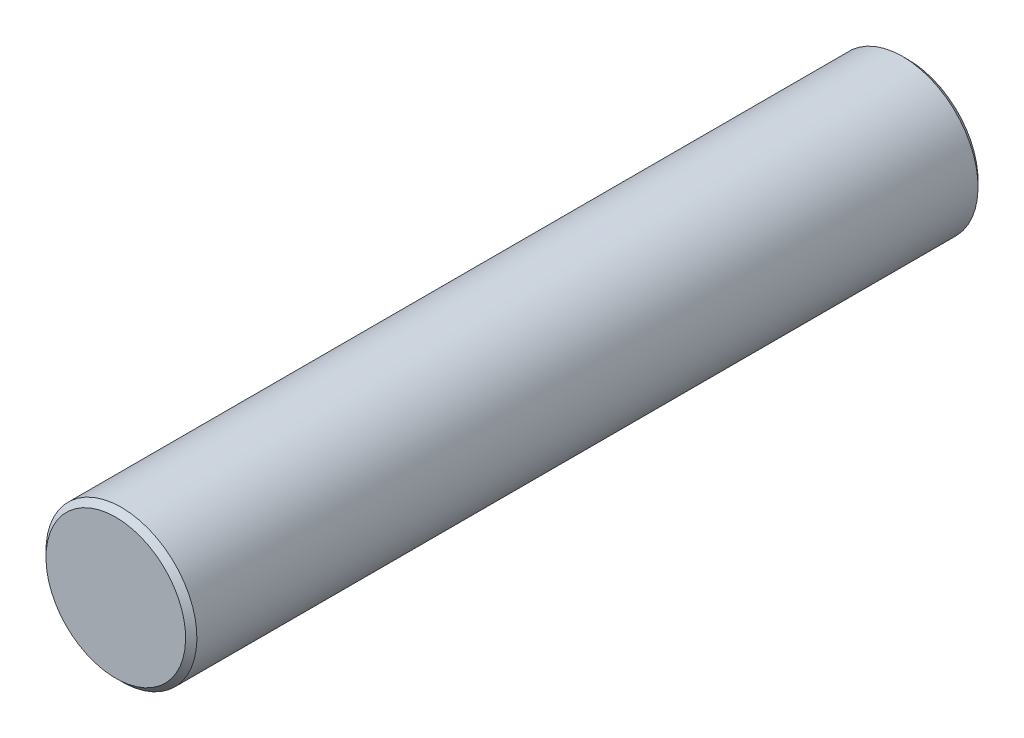
ISO-10303-21;
HEADER;
FILE_DESCRIPTION(('STEP AP214'),'2;1');
FILE_NAME('part.step','',(''),(''),'','','');
FILE_SCHEMA(('AUTOMOTIVE_DESIGN { 1 0 10303 214 1 1 1 1 }'));
ENDSEC;
DATA;
#1=APPLICATION_CONTEXT('core data for automotive mechanical design processes');
#2=APPLICATION_PROTOCOL_DEFINITION('international standard','automotive_design',2000,#1);
#3=PRODUCT_CONTEXT('',#1,'mechanical');
#4=PRODUCT('Part','Part','',(#3));
#5=PRODUCT_RELATED_PRODUCT_CATEGORY('part','',(#4));
#6=PRODUCT_DEFINITION_FORMATION('','',#4);
#7=PRODUCT_DEFINITION_CONTEXT('part definition',#1,'design');
#8=PRODUCT_DEFINITION('design','',#6,#7);
#9=PRODUCT_DEFINITION_SHAPE('','',#8);
#10=(LENGTH_UNIT() NAMED_UNIT(*) SI_UNIT(.MILLI.,.METRE.));
#11=(NAMED_UNIT(*) PLANE_ANGLE_UNIT() SI_UNIT($,.RADIAN.));
#12=(NAMED_UNIT(*) SI_UNIT($,.STERADIAN.) SOLID_ANGLE_UNIT());
#13=UNCERTAINTY_MEASURE_WITH_UNIT(LENGTH_MEASURE(1.E-05),#10,'distance_accuracy_value','');
#14=(GEOMETRIC_REPRESENTATION_CONTEXT(3) GLOBAL_UNCERTAINTY_ASSIGNED_CONTEXT((#13)) GLOBAL_UNIT_ASSIGNED_CONTEXT((#10,
#11,#12)) REPRESENTATION_CONTEXT('',''));
#15=CARTESIAN_POINT('',(0.,0.,0.));
#16=DIRECTION('',(0.,0.,1.));
#17=DIRECTION('',(1.,0.,0.));
#18=AXIS2_PLACEMENT_3D('',#15,#16,#17);
#19=CARTESIAN_POINT('',(0.,9.25,0.));
#20=DIRECTION('',(0.,0.,-1.));
#21=DIRECTION('',(0.,1.,0.));
#22=AXIS2_PLACEMENT_3D('',#19,#20,#21);
#23=PLANE('',#22);
#24=CARTESIAN_POINT('',(0.,0.,0.));
#25=DIRECTION('',(0.,0.,-1.));
#26=DIRECTION('',(0.,1.,0.));
#27=AXIS2_PLACEMENT_3D('',#24,#25,#26);
#28=CIRCLE('',#27,18.5);
#29=CARTESIAN_POINT('',(0.,18.5,0.));
#30=VERTEX_POINT('',#29);
#31=EDGE_CURVE('E9',#30,#30,#28,.T.);
#32=ORIENTED_EDGE('',*,*,#31,.T.);
#33=EDGE_LOOP('',(#32));
#34=FACE_BOUND('',#33,.T.);
#35=CARTESIAN_POINT('',(0.,0.,0.));
#36=DIRECTION('',(0.,0.,1.));
#37=DIRECTION('',(-1.,0.,0.));
#38=AXIS2_PLACEMENT_3D('',#35,#36,#37);
#39=CIRCLE('',#38,6.);
#40=CARTESIAN_POINT('',(-6.,0.,0.));
#41=VERTEX_POINT('',#40);
#42=EDGE_CURVE('E68',#41,#41,#39,.T.);
#43=ORIENTED_EDGE('',*,*,#42,.T.);
#44=EDGE_LOOP('',(#43));
#45=FACE_BOUND('',#44,.T.);
#46=ADVANCED_FACE('F15',(#34,#45),#23,.T.);
#47=CARTESIAN_POINT('',(0.,0.,0.75));
#48=DIRECTION('',(0.,0.,1.));
#49=DIRECTION('',(0.,1.,0.));
#50=AXIS2_PLACEMENT_3D('',#47,#48,#49);
#51=CONICAL_SURFACE('',#50,19.25,0.785398163397448);
#52=CARTESIAN_POINT('',(0.,0.,1.5));
#53=DIRECTION('',(0.,0.,-1.));
#54=DIRECTION('',(0.,1.,0.));
#55=AXIS2_PLACEMENT_3D('',#52,#53,#54);
#56=CIRCLE('',#55,20.);
#57=CARTESIAN_POINT('',(0.,20.,1.5));
#58=VERTEX_POINT('',#57);
#59=EDGE_CURVE('E22',#58,#58,#56,.T.);
#60=ORIENTED_EDGE('',*,*,#59,.T.);
#61=EDGE_LOOP('',(#60));
#62=FACE_BOUND('',#61,.T.);
#63=ORIENTED_EDGE('',*,*,#31,.F.);
#64=EDGE_LOOP('',(#63));
#65=FACE_BOUND('',#64,.T.);
#66=ADVANCED_FACE('F113',(#62,#65),#51,.T.);
#67=CARTESIAN_POINT('',(0.,0.,105.));
#68=DIRECTION('',(0.,0.,1.));
#69=DIRECTION('',(0.,1.,0.));
#70=AXIS2_PLACEMENT_3D('',#67,#68,#69);
#71=CYLINDRICAL_SURFACE('',#70,20.);
#72=CARTESIAN_POINT('',(0.,0.,208.5));
#73=DIRECTION('',(0.,0.,-1.));
#74=DIRECTION('',(0.,1.,0.));
#75=AXIS2_PLACEMENT_3D('',#72,#73,#74);
#76=CIRCLE('',#75,20.);
#77=CARTESIAN_POINT('',(0.,20.,208.5));
#78=VERTEX_POINT('',#77);
#79=EDGE_CURVE('E65',#78,#78,#76,.T.);
#80=ORIENTED_EDGE('',*,*,#79,.T.);
#81=EDGE_LOOP('',(#80));
#82=FACE_BOUND('',#81,.T.);
#83=ORIENTED_EDGE('',*,*,#59,.F.);
#84=EDGE_LOOP('',(#83));
#85=FACE_BOUND('',#84,.T.);
#86=CARTESIAN_POINT('',(0.,0.,6.5));
#87=DIRECTION('',(0.,0.,-1.));
#88=DIRECTION('',(0.,1.,0.));
#89=AXIS2_PLACEMENT_3D('',#86,#87,#88);
#90=CIRCLE('',#89,20.);
#91=CARTESIAN_POINT('',(10.5356537528527,-17.,6.5));
#92=VERTEX_POINT('',#91);
#93=CARTESIAN_POINT('',(-10.5356537528527,-17.,6.5));
#94=VERTEX_POINT('',#93);
#95=EDGE_CURVE('E81',#92,#94,#90,.T.);
#96=ORIENTED_EDGE('',*,*,#95,.T.);
#97=DIRECTION('',(0.,0.,1.));
#98=VECTOR('',#97,1.);
#99=CARTESIAN_POINT('',(-10.5356537528527,-17.,8.25));
#100=LINE('',#99,#98);
#101=CARTESIAN_POINT('',(-10.5356537528527,-17.,10.));
#102=VERTEX_POINT('',#101);
#103=EDGE_CURVE('E75',#94,#102,#100,.T.);
#104=ORIENTED_EDGE('',*,*,#103,.T.);
#105=CARTESIAN_POINT('',(0.,0.,10.));
#106=DIRECTION('',(0.,0.,1.));
#107=DIRECTION('',(0.,1.,0.));
#108=AXIS2_PLACEMENT_3D('',#105,#106,#107);
#109=CIRCLE('',#108,20.);
#110=CARTESIAN_POINT('',(10.5356537528527,-17.,10.));
#111=VERTEX_POINT('',#110);
#112=EDGE_CURVE('E87',#102,#111,#109,.T.);
#113=ORIENTED_EDGE('',*,*,#112,.T.);
#114=DIRECTION('',(0.,0.,-1.));
#115=VECTOR('',#114,1.);
#116=CARTESIAN_POINT('',(10.5356537528527,-17.,8.25));
#117=LINE('',#116,#115);
#118=EDGE_CURVE('E74',#111,#92,#117,.T.);
#119=ORIENTED_EDGE('',*,*,#118,.T.);
#120=EDGE_LOOP('',(#96,#104,#113,#119));
#121=FACE_BOUND('',#120,.T.);
#122=ADVANCED_FACE('F92',(#82,#85,#121),#71,.T.);
#123=CARTESIAN_POINT('',(0.,0.,209.25));
#124=DIRECTION('',(0.,0.,-1.));
#125=DIRECTION('',(0.,1.,0.));
#126=AXIS2_PLACEMENT_3D('',#123,#124,#125);
#127=CONICAL_SURFACE('',#126,19.25,0.785398163397448);
#128=CARTESIAN_POINT('',(0.,0.,210.));
#129=DIRECTION('',(0.,0.,-1.));
#130=DIRECTION('',(0.,1.,0.));
#131=AXIS2_PLACEMENT_3D('',#128,#129,#130);
#132=CIRCLE('',#131,18.5);
#133=CARTESIAN_POINT('',(0.,18.5,210.));
#134=VERTEX_POINT('',#133);
#135=EDGE_CURVE('E61',#134,#134,#132,.T.);
#136=ORIENTED_EDGE('',*,*,#135,.T.);
#137=EDGE_LOOP('',(#136));
#138=FACE_BOUND('',#137,.T.);
#139=ORIENTED_EDGE('',*,*,#79,.F.);
#140=EDGE_LOOP('',(#139));
#141=FACE_BOUND('',#140,.T.);
#142=ADVANCED_FACE('F62',(#138,#141),#127,.T.);
#143=CARTESIAN_POINT('',(0.,9.25,210.));
#144=DIRECTION('',(0.,0.,1.));
#145=DIRECTION('',(0.,-1.,0.));
#146=AXIS2_PLACEMENT_3D('',#143,#144,#145);
#147=PLANE('',#146);
#148=ORIENTED_EDGE('',*,*,#135,.F.);
#149=EDGE_LOOP('',(#148));
#150=FACE_BOUND('',#149,.T.);
#151=ADVANCED_FACE('F135',(#150),#147,.T.);
#152=CARTESIAN_POINT('',(0.,0.,26.4586213285198));
#153=DIRECTION('',(0.,0.,-1.));
#154=DIRECTION('',(-1.,0.,0.));
#155=AXIS2_PLACEMENT_3D('',#152,#153,#154);
#156=CONICAL_SURFACE('',#155,2.52640625,1.0471975511966);
#157=CARTESIAN_POINT('',(0.,0.,25.));
#158=DIRECTION('',(0.,0.,1.));
#159=DIRECTION('',(-1.,0.,0.));
#160=AXIS2_PLACEMENT_3D('',#157,#158,#159);
#161=CIRCLE('',#160,5.0528125);
#162=CARTESIAN_POINT('',(-5.0528125,0.,25.));
#163=VERTEX_POINT('',#162);
#164=EDGE_CURVE('E66',#163,#163,#161,.T.);
#165=ORIENTED_EDGE('',*,*,#164,.F.);
#166=EDGE_LOOP('',(#165));
#167=FACE_BOUND('',#166,.T.);
#168=CARTESIAN_POINT('',(0.,0.,27.9172426570397));
#169=VERTEX_POINT('',#168);
#170=VERTEX_LOOP('',#169);
#171=FACE_BOUND('',#170,.T.);
#172=ADVANCED_FACE('F129',(#167,#171),#156,.F.);
#173=CARTESIAN_POINT('',(0.,0.,12.97359375));
#174=DIRECTION('',(0.,0.,-1.));
#175=DIRECTION('',(-1.,0.,0.));
#176=AXIS2_PLACEMENT_3D('',#173,#174,#175);
#177=CYLINDRICAL_SURFACE('',#176,5.0528125);
#178=CARTESIAN_POINT('',(0.,0.,0.9471875));
#179=DIRECTION('',(0.,0.,1.));
#180=DIRECTION('',(-1.,0.,0.));
#181=AXIS2_PLACEMENT_3D('',#178,#179,#180);
#182=CIRCLE('',#181,5.0528125);
#183=CARTESIAN_POINT('',(-5.0528125,0.,0.9471875));
#184=VERTEX_POINT('',#183);
#185=EDGE_CURVE('E72',#184,#184,#182,.T.);
#186=ORIENTED_EDGE('',*,*,#185,.F.);
#187=EDGE_LOOP('',(#186));
#188=FACE_BOUND('',#187,.T.);
#189=ORIENTED_EDGE('',*,*,#164,.T.);
#190=EDGE_LOOP('',(#189));
#191=FACE_BOUND('',#190,.T.);
#192=ADVANCED_FACE('F123',(#188,#191),#177,.F.);
#193=CARTESIAN_POINT('',(0.,0.,0.47359375));
#194=DIRECTION('',(0.,0.,-1.));
#195=DIRECTION('',(-1.,0.,0.));
#196=AXIS2_PLACEMENT_3D('',#193,#194,#195);
#197=CONICAL_SURFACE('',#196,5.52640625,0.785398163397448);
#198=ORIENTED_EDGE('',*,*,#42,.F.);
#199=EDGE_LOOP('',(#198));
#200=FACE_BOUND('',#199,.T.);
#201=ORIENTED_EDGE('',*,*,#185,.T.);
#202=EDGE_LOOP('',(#201));
#203=FACE_BOUND('',#202,.T.);
#204=ADVANCED_FACE('F110',(#200,#203),#197,.F.);
#205=CARTESIAN_POINT('',(0.,-17.,8.25));
#206=DIRECTION('',(0.,-1.,0.));
#207=DIRECTION('',(0.,0.,-1.));
#208=AXIS2_PLACEMENT_3D('',#205,#206,#207);
#209=PLANE('',#208);
#210=ORIENTED_EDGE('',*,*,#103,.F.);
#211=DIRECTION('',(1.,0.,0.));
#212=VECTOR('',#211,1.);
#213=CARTESIAN_POINT('',(0.,-17.,6.5));
#214=LINE('',#213,#212);
#215=EDGE_CURVE('E78',#94,#92,#214,.T.);
#216=ORIENTED_EDGE('',*,*,#215,.T.);
#217=ORIENTED_EDGE('',*,*,#118,.F.);
#218=DIRECTION('',(-1.,0.,0.));
#219=VECTOR('',#218,1.);
#220=CARTESIAN_POINT('',(0.,-17.,10.));
#221=LINE('',#220,#219);
#222=EDGE_CURVE('E84',#111,#102,#221,.T.);
#223=ORIENTED_EDGE('',*,*,#222,.T.);
#224=EDGE_LOOP('',(#210,#216,#217,#223));
#225=FACE_BOUND('',#224,.T.);
#226=ADVANCED_FACE('F97',(#225),#209,.T.);
#227=CARTESIAN_POINT('',(0.,-19.5,6.5));
#228=DIRECTION('',(0.,0.,1.));
#229=DIRECTION('',(1.,0.,0.));
#230=AXIS2_PLACEMENT_3D('',#227,#228,#229);
#231=PLANE('',#230);
#232=ORIENTED_EDGE('',*,*,#95,.F.);
#233=ORIENTED_EDGE('',*,*,#215,.F.);
#234=EDGE_LOOP('',(#232,#233));
#235=FACE_BOUND('',#234,.T.);
#236=ADVANCED_FACE('F101',(#235),#231,.T.);
#237=CARTESIAN_POINT('',(0.,-19.5,10.));
#238=DIRECTION('',(0.,0.,1.));
#239=DIRECTION('',(1.,0.,0.));
#240=AXIS2_PLACEMENT_3D('',#237,#238,#239);
#241=PLANE('',#240);
#242=ORIENTED_EDGE('',*,*,#112,.F.);
#243=ORIENTED_EDGE('',*,*,#222,.F.);
#244=EDGE_LOOP('',(#242,#243));
#245=FACE_BOUND('',#244,.T.);
#246=ADVANCED_FACE('F95',(#245),#241,.F.);
#247=CLOSED_SHELL('',(#46,#66,#122,#142,#151,#172,#192,#204,#226,#236,#246));
#248=MANIFOLD_SOLID_BREP('B1',#247);
#249=ADVANCED_BREP_SHAPE_REPRESENTATION('',(#18,#248),#14);
#250=SHAPE_DEFINITION_REPRESENTATION(#9,#249);
ENDSEC;
END-ISO-10303-21;
